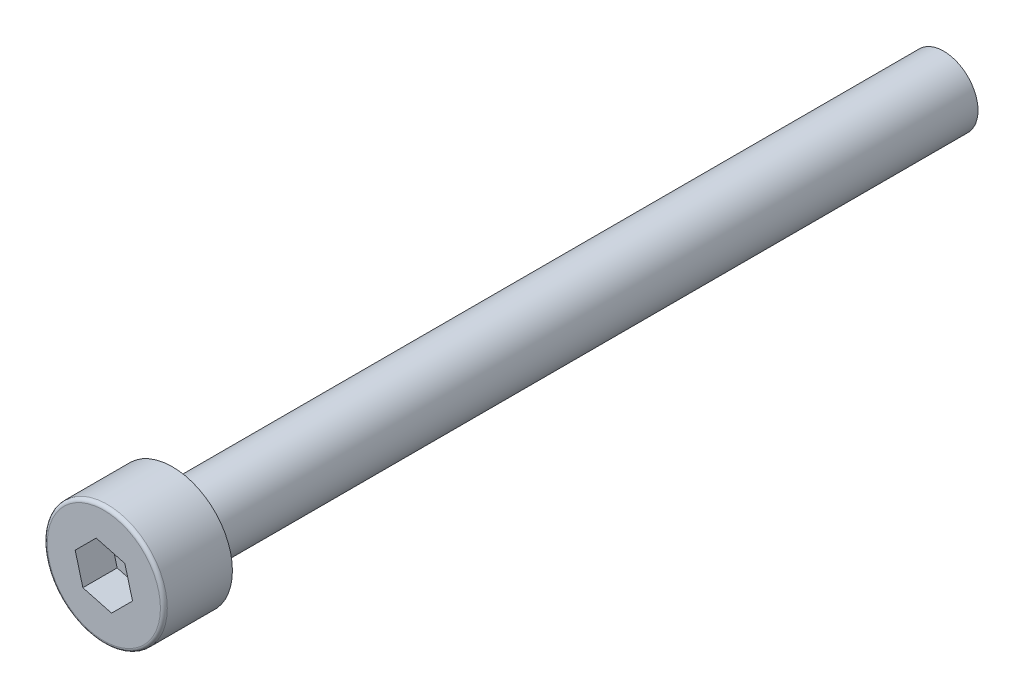
ISO-10303-21;
HEADER;
FILE_DESCRIPTION(('STEP AP214'),'2;1');
FILE_NAME('part.step','',(''),(''),'','','');
FILE_SCHEMA(('AUTOMOTIVE_DESIGN { 1 0 10303 214 1 1 1 1 }'));
ENDSEC;
DATA;
#1=APPLICATION_CONTEXT('core data for automotive mechanical design processes');
#2=APPLICATION_PROTOCOL_DEFINITION('international standard','automotive_design',2000,#1);
#3=PRODUCT_CONTEXT('',#1,'mechanical');
#4=PRODUCT('Part','Part','',(#3));
#5=PRODUCT_RELATED_PRODUCT_CATEGORY('part','',(#4));
#6=PRODUCT_DEFINITION_FORMATION('','',#4);
#7=PRODUCT_DEFINITION_CONTEXT('part definition',#1,'design');
#8=PRODUCT_DEFINITION('design','',#6,#7);
#9=PRODUCT_DEFINITION_SHAPE('','',#8);
#10=(LENGTH_UNIT() NAMED_UNIT(*) SI_UNIT(.MILLI.,.METRE.));
#11=(NAMED_UNIT(*) PLANE_ANGLE_UNIT() SI_UNIT($,.RADIAN.));
#12=(NAMED_UNIT(*) SI_UNIT($,.STERADIAN.) SOLID_ANGLE_UNIT());
#13=UNCERTAINTY_MEASURE_WITH_UNIT(LENGTH_MEASURE(1.E-05),#10,'distance_accuracy_value','');
#14=(GEOMETRIC_REPRESENTATION_CONTEXT(3) GLOBAL_UNCERTAINTY_ASSIGNED_CONTEXT((#13)) GLOBAL_UNIT_ASSIGNED_CONTEXT((#10,
#11,#12)) REPRESENTATION_CONTEXT('',''));
#15=CARTESIAN_POINT('',(0.,0.,0.));
#16=DIRECTION('',(0.,0.,1.));
#17=DIRECTION('',(1.,0.,0.));
#18=AXIS2_PLACEMENT_3D('',#15,#16,#17);
#19=CARTESIAN_POINT('',(0.,0.,0.));
#20=DIRECTION('',(0.,0.,1.));
#21=DIRECTION('',(1.,0.,0.));
#22=AXIS2_PLACEMENT_3D('',#19,#20,#21);
#23=PLANE('',#22);
#24=CARTESIAN_POINT('',(0.,0.,0.));
#25=DIRECTION('',(0.,0.,1.));
#26=DIRECTION('',(1.,0.,0.));
#27=AXIS2_PLACEMENT_3D('',#24,#25,#26);
#28=CIRCLE('',#27,3.5);
#29=CARTESIAN_POINT('',(3.5,0.,0.));
#30=VERTEX_POINT('',#29);
#31=EDGE_CURVE('E137',#30,#30,#28,.T.);
#32=ORIENTED_EDGE('',*,*,#31,.F.);
#33=EDGE_LOOP('',(#32));
#34=FACE_BOUND('',#33,.T.);
#35=CARTESIAN_POINT('',(0.,0.,0.));
#36=DIRECTION('',(0.,0.,1.));
#37=DIRECTION('',(1.,0.,0.));
#38=AXIS2_PLACEMENT_3D('',#35,#36,#37);
#39=CIRCLE('',#38,2.);
#40=CARTESIAN_POINT('',(2.,0.,0.));
#41=VERTEX_POINT('',#40);
#42=EDGE_CURVE('E145',#41,#41,#39,.F.);
#43=ORIENTED_EDGE('',*,*,#42,.F.);
#44=EDGE_LOOP('',(#43));
#45=FACE_BOUND('',#44,.T.);
#46=ADVANCED_FACE('F34',(#34,#45),#23,.F.);
#47=CARTESIAN_POINT('',(0.,0.,4.));
#48=DIRECTION('',(0.,0.,-1.));
#49=DIRECTION('',(-1.,0.,0.));
#50=AXIS2_PLACEMENT_3D('',#47,#48,#49);
#51=CYLINDRICAL_SURFACE('',#50,3.5);
#52=CARTESIAN_POINT('',(0.,0.,3.8));
#53=DIRECTION('',(0.,0.,1.));
#54=DIRECTION('',(1.,0.,0.));
#55=AXIS2_PLACEMENT_3D('',#52,#53,#54);
#56=CIRCLE('',#55,3.5);
#57=CARTESIAN_POINT('',(3.5,0.,3.8));
#58=VERTEX_POINT('',#57);
#59=EDGE_CURVE('E11',#58,#58,#56,.F.);
#60=ORIENTED_EDGE('',*,*,#59,.T.);
#61=EDGE_LOOP('',(#60));
#62=FACE_BOUND('',#61,.T.);
#63=ORIENTED_EDGE('',*,*,#31,.T.);
#64=EDGE_LOOP('',(#63));
#65=FACE_BOUND('',#64,.T.);
#66=ADVANCED_FACE('F164',(#62,#65),#51,.T.);
#67=CARTESIAN_POINT('',(0.,0.,4.));
#68=DIRECTION('',(0.,0.,1.));
#69=DIRECTION('',(1.,0.,0.));
#70=AXIS2_PLACEMENT_3D('',#67,#68,#69);
#71=PLANE('',#70);
#72=CARTESIAN_POINT('',(0.,0.,4.));
#73=DIRECTION('',(0.,0.,1.));
#74=DIRECTION('',(1.,0.,0.));
#75=AXIS2_PLACEMENT_3D('',#72,#73,#74);
#76=CIRCLE('',#75,3.3);
#77=CARTESIAN_POINT('',(3.3,0.,4.));
#78=VERTEX_POINT('',#77);
#79=EDGE_CURVE('E42',#78,#78,#76,.T.);
#80=ORIENTED_EDGE('',*,*,#79,.T.);
#81=EDGE_LOOP('',(#80));
#82=FACE_BOUND('',#81,.T.);
#83=DIRECTION('',(0.258819045102521,-0.965925826289068,0.));
#84=VECTOR('',#83,1.);
#85=CARTESIAN_POINT('',(-1.67303260747562,0.448287736084027,4.));
#86=LINE('',#85,#84);
#87=CARTESIAN_POINT('',(-1.67303260747562,0.448287736084027,4.));
#88=VERTEX_POINT('',#87);
#89=CARTESIAN_POINT('',(-1.22474487139159,-1.22474487139159,4.));
#90=VERTEX_POINT('',#89);
#91=EDGE_CURVE('E49',#88,#90,#86,.T.);
#92=ORIENTED_EDGE('',*,*,#91,.F.);
#93=DIRECTION('',(-0.707106781186547,-0.707106781186548,0.));
#94=VECTOR('',#93,1.);
#95=CARTESIAN_POINT('',(-0.448287736084027,1.67303260747562,4.));
#96=LINE('',#95,#94);
#97=CARTESIAN_POINT('',(-0.448287736084027,1.67303260747562,4.));
#98=VERTEX_POINT('',#97);
#99=EDGE_CURVE('E133',#98,#88,#96,.T.);
#100=ORIENTED_EDGE('',*,*,#99,.F.);
#101=DIRECTION('',(-0.965925826289068,0.258819045102521,0.));
#102=VECTOR('',#101,1.);
#103=CARTESIAN_POINT('',(1.22474487139159,1.22474487139159,4.));
#104=LINE('',#103,#102);
#105=CARTESIAN_POINT('',(1.22474487139159,1.22474487139159,4.));
#106=VERTEX_POINT('',#105);
#107=EDGE_CURVE('E131',#106,#98,#104,.T.);
#108=ORIENTED_EDGE('',*,*,#107,.F.);
#109=DIRECTION('',(-0.258819045102521,0.965925826289068,0.));
#110=VECTOR('',#109,1.);
#111=CARTESIAN_POINT('',(1.67303260747562,-0.448287736084027,4.));
#112=LINE('',#111,#110);
#113=CARTESIAN_POINT('',(1.67303260747562,-0.448287736084027,4.));
#114=VERTEX_POINT('',#113);
#115=EDGE_CURVE('E97',#114,#106,#112,.T.);
#116=ORIENTED_EDGE('',*,*,#115,.F.);
#117=DIRECTION('',(0.707106781186547,0.707106781186548,0.));
#118=VECTOR('',#117,1.);
#119=CARTESIAN_POINT('',(0.448287736084026,-1.67303260747562,4.));
#120=LINE('',#119,#118);
#121=CARTESIAN_POINT('',(0.448287736084026,-1.67303260747562,4.));
#122=VERTEX_POINT('',#121);
#123=EDGE_CURVE('E127',#122,#114,#120,.T.);
#124=ORIENTED_EDGE('',*,*,#123,.F.);
#125=DIRECTION('',(0.965925826289068,-0.258819045102521,0.));
#126=VECTOR('',#125,1.);
#127=CARTESIAN_POINT('',(-1.22474487139159,-1.22474487139159,4.));
#128=LINE('',#127,#126);
#129=EDGE_CURVE('E123',#90,#122,#128,.T.);
#130=ORIENTED_EDGE('',*,*,#129,.F.);
#131=EDGE_LOOP('',(#92,#100,#108,#116,#124,#130));
#132=FACE_BOUND('',#131,.T.);
#133=ADVANCED_FACE('F150',(#82,#132),#71,.T.);
#134=CARTESIAN_POINT('',(-1.67303260747562,0.448287736084027,2.));
#135=DIRECTION('',(-0.965925826289068,-0.258819045102521,0.));
#136=DIRECTION('',(0.258819045102521,-0.965925826289068,0.));
#137=AXIS2_PLACEMENT_3D('',#134,#135,#136);
#138=PLANE('',#137);
#139=ORIENTED_EDGE('',*,*,#91,.T.);
#140=DIRECTION('',(0.,0.,1.));
#141=VECTOR('',#140,1.);
#142=CARTESIAN_POINT('',(-1.22474487139159,-1.22474487139159,2.));
#143=LINE('',#142,#141);
#144=CARTESIAN_POINT('',(-1.22474487139159,-1.22474487139159,2.));
#145=VERTEX_POINT('',#144);
#146=EDGE_CURVE('E79',#145,#90,#143,.T.);
#147=ORIENTED_EDGE('',*,*,#146,.F.);
#148=DIRECTION('',(0.258819045102521,-0.965925826289068,0.));
#149=VECTOR('',#148,1.);
#150=CARTESIAN_POINT('',(-1.67303260747562,0.448287736084027,2.));
#151=LINE('',#150,#149);
#152=CARTESIAN_POINT('',(-1.67303260747562,0.448287736084027,2.));
#153=VERTEX_POINT('',#152);
#154=EDGE_CURVE('E135',#153,#145,#151,.T.);
#155=ORIENTED_EDGE('',*,*,#154,.F.);
#156=DIRECTION('',(0.,0.,1.));
#157=VECTOR('',#156,1.);
#158=CARTESIAN_POINT('',(-1.67303260747562,0.448287736084027,2.));
#159=LINE('',#158,#157);
#160=EDGE_CURVE('E57',#153,#88,#159,.T.);
#161=ORIENTED_EDGE('',*,*,#160,.T.);
#162=EDGE_LOOP('',(#139,#147,#155,#161));
#163=FACE_BOUND('',#162,.T.);
#164=ADVANCED_FACE('F176',(#163),#138,.F.);
#165=CARTESIAN_POINT('',(-0.448287736084027,1.67303260747562,2.));
#166=DIRECTION('',(-0.707106781186548,0.707106781186547,0.));
#167=DIRECTION('',(-0.707106781186547,-0.707106781186548,0.));
#168=AXIS2_PLACEMENT_3D('',#165,#166,#167);
#169=PLANE('',#168);
#170=ORIENTED_EDGE('',*,*,#99,.T.);
#171=ORIENTED_EDGE('',*,*,#160,.F.);
#172=DIRECTION('',(-0.707106781186547,-0.707106781186548,0.));
#173=VECTOR('',#172,1.);
#174=CARTESIAN_POINT('',(-0.448287736084027,1.67303260747562,2.));
#175=LINE('',#174,#173);
#176=CARTESIAN_POINT('',(-0.448287736084027,1.67303260747562,2.));
#177=VERTEX_POINT('',#176);
#178=EDGE_CURVE('E109',#177,#153,#175,.T.);
#179=ORIENTED_EDGE('',*,*,#178,.F.);
#180=DIRECTION('',(0.,0.,1.));
#181=VECTOR('',#180,1.);
#182=CARTESIAN_POINT('',(-0.448287736084027,1.67303260747562,2.));
#183=LINE('',#182,#181);
#184=EDGE_CURVE('E101',#177,#98,#183,.T.);
#185=ORIENTED_EDGE('',*,*,#184,.T.);
#186=EDGE_LOOP('',(#170,#171,#179,#185));
#187=FACE_BOUND('',#186,.T.);
#188=ADVANCED_FACE('F179',(#187),#169,.F.);
#189=CARTESIAN_POINT('',(1.22474487139159,1.22474487139159,2.));
#190=DIRECTION('',(0.258819045102521,0.965925826289068,0.));
#191=DIRECTION('',(-0.965925826289068,0.258819045102521,0.));
#192=AXIS2_PLACEMENT_3D('',#189,#190,#191);
#193=PLANE('',#192);
#194=ORIENTED_EDGE('',*,*,#107,.T.);
#195=ORIENTED_EDGE('',*,*,#184,.F.);
#196=DIRECTION('',(-0.965925826289068,0.258819045102521,0.));
#197=VECTOR('',#196,1.);
#198=CARTESIAN_POINT('',(1.22474487139159,1.22474487139159,2.));
#199=LINE('',#198,#197);
#200=CARTESIAN_POINT('',(1.22474487139159,1.22474487139159,2.));
#201=VERTEX_POINT('',#200);
#202=EDGE_CURVE('E105',#201,#177,#199,.T.);
#203=ORIENTED_EDGE('',*,*,#202,.F.);
#204=DIRECTION('',(0.,0.,1.));
#205=VECTOR('',#204,1.);
#206=CARTESIAN_POINT('',(1.22474487139159,1.22474487139159,2.));
#207=LINE('',#206,#205);
#208=EDGE_CURVE('E90',#201,#106,#207,.T.);
#209=ORIENTED_EDGE('',*,*,#208,.T.);
#210=EDGE_LOOP('',(#194,#195,#203,#209));
#211=FACE_BOUND('',#210,.T.);
#212=ADVANCED_FACE('F106',(#211),#193,.F.);
#213=CARTESIAN_POINT('',(1.67303260747562,-0.448287736084027,2.));
#214=DIRECTION('',(0.965925826289068,0.258819045102521,0.));
#215=DIRECTION('',(-0.258819045102521,0.965925826289068,0.));
#216=AXIS2_PLACEMENT_3D('',#213,#214,#215);
#217=PLANE('',#216);
#218=ORIENTED_EDGE('',*,*,#115,.T.);
#219=ORIENTED_EDGE('',*,*,#208,.F.);
#220=DIRECTION('',(-0.258819045102521,0.965925826289068,0.));
#221=VECTOR('',#220,1.);
#222=CARTESIAN_POINT('',(1.67303260747562,-0.448287736084027,2.));
#223=LINE('',#222,#221);
#224=CARTESIAN_POINT('',(1.67303260747562,-0.448287736084027,2.));
#225=VERTEX_POINT('',#224);
#226=EDGE_CURVE('E94',#225,#201,#223,.T.);
#227=ORIENTED_EDGE('',*,*,#226,.F.);
#228=DIRECTION('',(0.,0.,1.));
#229=VECTOR('',#228,1.);
#230=CARTESIAN_POINT('',(1.67303260747562,-0.448287736084027,2.));
#231=LINE('',#230,#229);
#232=EDGE_CURVE('E102',#225,#114,#231,.T.);
#233=ORIENTED_EDGE('',*,*,#232,.T.);
#234=EDGE_LOOP('',(#218,#219,#227,#233));
#235=FACE_BOUND('',#234,.T.);
#236=ADVANCED_FACE('F92',(#235),#217,.F.);
#237=CARTESIAN_POINT('',(0.448287736084026,-1.67303260747562,2.));
#238=DIRECTION('',(0.707106781186548,-0.707106781186547,0.));
#239=DIRECTION('',(0.707106781186547,0.707106781186548,0.));
#240=AXIS2_PLACEMENT_3D('',#237,#238,#239);
#241=PLANE('',#240);
#242=ORIENTED_EDGE('',*,*,#123,.T.);
#243=ORIENTED_EDGE('',*,*,#232,.F.);
#244=DIRECTION('',(0.707106781186547,0.707106781186548,0.));
#245=VECTOR('',#244,1.);
#246=CARTESIAN_POINT('',(0.448287736084026,-1.67303260747562,2.));
#247=LINE('',#246,#245);
#248=CARTESIAN_POINT('',(0.448287736084026,-1.67303260747562,2.));
#249=VERTEX_POINT('',#248);
#250=EDGE_CURVE('E115',#249,#225,#247,.T.);
#251=ORIENTED_EDGE('',*,*,#250,.F.);
#252=DIRECTION('',(0.,0.,1.));
#253=VECTOR('',#252,1.);
#254=CARTESIAN_POINT('',(0.448287736084026,-1.67303260747562,2.));
#255=LINE('',#254,#253);
#256=EDGE_CURVE('E140',#249,#122,#255,.T.);
#257=ORIENTED_EDGE('',*,*,#256,.T.);
#258=EDGE_LOOP('',(#242,#243,#251,#257));
#259=FACE_BOUND('',#258,.T.);
#260=ADVANCED_FACE('F183',(#259),#241,.F.);
#261=CARTESIAN_POINT('',(-1.22474487139159,-1.22474487139159,2.));
#262=DIRECTION('',(-0.258819045102521,-0.965925826289068,0.));
#263=DIRECTION('',(0.965925826289068,-0.258819045102521,0.));
#264=AXIS2_PLACEMENT_3D('',#261,#262,#263);
#265=PLANE('',#264);
#266=ORIENTED_EDGE('',*,*,#129,.T.);
#267=ORIENTED_EDGE('',*,*,#256,.F.);
#268=DIRECTION('',(0.965925826289068,-0.258819045102521,0.));
#269=VECTOR('',#268,1.);
#270=CARTESIAN_POINT('',(-1.22474487139159,-1.22474487139159,2.));
#271=LINE('',#270,#269);
#272=EDGE_CURVE('E117',#145,#249,#271,.T.);
#273=ORIENTED_EDGE('',*,*,#272,.F.);
#274=ORIENTED_EDGE('',*,*,#146,.T.);
#275=EDGE_LOOP('',(#266,#267,#273,#274));
#276=FACE_BOUND('',#275,.T.);
#277=ADVANCED_FACE('F180',(#276),#265,.F.);
#278=CARTESIAN_POINT('',(0.,0.,2.));
#279=DIRECTION('',(0.,0.,1.));
#280=DIRECTION('',(1.,0.,0.));
#281=AXIS2_PLACEMENT_3D('',#278,#279,#280);
#282=PLANE('',#281);
#283=ORIENTED_EDGE('',*,*,#154,.T.);
#284=ORIENTED_EDGE('',*,*,#272,.T.);
#285=ORIENTED_EDGE('',*,*,#250,.T.);
#286=ORIENTED_EDGE('',*,*,#226,.T.);
#287=ORIENTED_EDGE('',*,*,#202,.T.);
#288=ORIENTED_EDGE('',*,*,#178,.T.);
#289=EDGE_LOOP('',(#283,#284,#285,#286,#287,#288));
#290=FACE_BOUND('',#289,.T.);
#291=ADVANCED_FACE('F112',(#290),#282,.T.);
#292=CARTESIAN_POINT('',(0.,0.,-45.));
#293=DIRECTION('',(0.,0.,1.));
#294=DIRECTION('',(1.,0.,0.));
#295=AXIS2_PLACEMENT_3D('',#292,#293,#294);
#296=CYLINDRICAL_SURFACE('',#295,2.);
#297=CARTESIAN_POINT('',(0.,0.,-45.));
#298=DIRECTION('',(0.,0.,-1.));
#299=DIRECTION('',(-1.,0.,0.));
#300=AXIS2_PLACEMENT_3D('',#297,#298,#299);
#301=CIRCLE('',#300,2.);
#302=CARTESIAN_POINT('',(2.,0.,-45.));
#303=VERTEX_POINT('',#302);
#304=EDGE_CURVE('E124',#303,#303,#301,.T.);
#305=CARTESIAN_POINT('',(2.,0.,-45.));
#306=CARTESIAN_POINT('',(2.,0.,-44.53125));
#307=CARTESIAN_POINT('',(2.,0.,-44.0625));
#308=CARTESIAN_POINT('',(2.,0.,-43.125));
#309=CARTESIAN_POINT('',(2.,0.,-42.65625));
#310=CARTESIAN_POINT('',(2.,0.,-41.71875));
#311=CARTESIAN_POINT('',(2.,0.,-41.25));
#312=CARTESIAN_POINT('',(2.,0.,-40.3125));
#313=CARTESIAN_POINT('',(2.,0.,-39.84375));
#314=CARTESIAN_POINT('',(2.,0.,-38.90625));
#315=CARTESIAN_POINT('',(2.,0.,-38.4375));
#316=CARTESIAN_POINT('',(2.,0.,-37.5));
#317=CARTESIAN_POINT('',(2.,0.,-37.03125));
#318=CARTESIAN_POINT('',(2.,0.,-36.09375));
#319=CARTESIAN_POINT('',(2.,0.,-35.625));
#320=CARTESIAN_POINT('',(2.,0.,-34.6875));
#321=CARTESIAN_POINT('',(2.,0.,-34.21875));
#322=CARTESIAN_POINT('',(2.,0.,-33.28125));
#323=CARTESIAN_POINT('',(2.,0.,-32.8125));
#324=CARTESIAN_POINT('',(2.,0.,-31.875));
#325=CARTESIAN_POINT('',(2.,0.,-31.40625));
#326=CARTESIAN_POINT('',(2.,0.,-30.46875));
#327=CARTESIAN_POINT('',(2.,0.,-30.));
#328=CARTESIAN_POINT('',(2.,0.,-29.0625));
#329=CARTESIAN_POINT('',(2.,0.,-28.59375));
#330=CARTESIAN_POINT('',(2.,0.,-27.65625));
#331=CARTESIAN_POINT('',(2.,0.,-27.1875));
#332=CARTESIAN_POINT('',(2.,0.,-26.25));
#333=CARTESIAN_POINT('',(2.,0.,-25.78125));
#334=CARTESIAN_POINT('',(2.,0.,-24.84375));
#335=CARTESIAN_POINT('',(2.,0.,-24.375));
#336=CARTESIAN_POINT('',(2.,0.,-23.4375));
#337=CARTESIAN_POINT('',(2.,0.,-22.96875));
#338=CARTESIAN_POINT('',(2.,0.,-22.03125));
#339=CARTESIAN_POINT('',(2.,0.,-21.5625));
#340=CARTESIAN_POINT('',(2.,0.,-20.625));
#341=CARTESIAN_POINT('',(2.,0.,-20.15625));
#342=CARTESIAN_POINT('',(2.,0.,-19.21875));
#343=CARTESIAN_POINT('',(2.,0.,-18.75));
#344=CARTESIAN_POINT('',(2.,0.,-17.8125));
#345=CARTESIAN_POINT('',(2.,0.,-17.34375));
#346=CARTESIAN_POINT('',(2.,0.,-16.40625));
#347=CARTESIAN_POINT('',(2.,0.,-15.9375));
#348=CARTESIAN_POINT('',(2.,0.,-15.));
#349=CARTESIAN_POINT('',(2.,0.,-14.53125));
#350=CARTESIAN_POINT('',(2.,0.,-13.59375));
#351=CARTESIAN_POINT('',(2.,0.,-13.125));
#352=CARTESIAN_POINT('',(2.,0.,-12.1875));
#353=CARTESIAN_POINT('',(2.,0.,-11.71875));
#354=CARTESIAN_POINT('',(2.,0.,-10.78125));
#355=CARTESIAN_POINT('',(2.,0.,-10.3125));
#356=CARTESIAN_POINT('',(2.,0.,-9.37500000000001));
#357=CARTESIAN_POINT('',(2.,0.,-8.90625000000001));
#358=CARTESIAN_POINT('',(2.,0.,-7.96875000000001));
#359=CARTESIAN_POINT('',(2.,0.,-7.5));
#360=CARTESIAN_POINT('',(2.,0.,-6.5625));
#361=CARTESIAN_POINT('',(2.,0.,-6.09375));
#362=CARTESIAN_POINT('',(2.,0.,-5.15625000000001));
#363=CARTESIAN_POINT('',(2.,0.,-4.68750000000001));
#364=CARTESIAN_POINT('',(2.,0.,-3.75000000000001));
#365=CARTESIAN_POINT('',(2.,0.,-3.28125000000001));
#366=CARTESIAN_POINT('',(2.,0.,-2.34375000000001));
#367=CARTESIAN_POINT('',(2.,0.,-1.87500000000001));
#368=CARTESIAN_POINT('',(2.,0.,-0.937500000000006));
#369=CARTESIAN_POINT('',(2.,0.,-0.468750000000007));
#370=CARTESIAN_POINT('',(2.,0.,0.));
#371=B_SPLINE_CURVE_WITH_KNOTS('',3,(#305,#306,#307,#308,#309,#310,#311,#312,#313,#314,#315,
#316,#317,#318,#319,#320,#321,#322,#323,#324,#325,#326,#327,#328,#329,#330,#331,#332,#333,#334,
#335,#336,#337,#338,#339,#340,#341,#342,#343,#344,#345,#346,#347,#348,#349,#350,#351,#352,#353,
#354,#355,#356,#357,#358,#359,#360,#361,#362,#363,#364,#365,#366,#367,#368,#369,#370),
.UNSPECIFIED.,.F.,.F.,(4,2,2,2,2,2,2,2,2,2,2,2,2,2,2,2,2,2,2,2,2,2,2,2,2,2,2,2,2,2,2,2,4),(0.,
1.40625,2.8125,4.21874999999999,5.625,7.03125,8.43749999999999,9.84374999999999,11.25,12.65625,
14.0625,15.46875,16.875,18.28125,19.6875,21.09375,22.5,23.90625,25.3125,26.71875,28.125,
29.53125,30.9375,32.34375,33.75,35.15625,36.5625,37.96875,39.375,40.78125,42.1875,43.59375,45.),.UNSPECIFIED.);
#372=EDGE_CURVE('BSEAM159',#303,#41,#371,.T.);
#373=ORIENTED_EDGE('',*,*,#304,.F.);
#374=ORIENTED_EDGE('',*,*,#42,.T.);
#375=ORIENTED_EDGE('',*,*,#372,.T.);
#376=ORIENTED_EDGE('',*,*,#372,.F.);
#377=EDGE_LOOP('',(#373,#375,#374,#376));
#378=FACE_BOUND('',#377,.T.);
#379=ADVANCED_FACE('F159',(#378),#296,.T.);
#380=CARTESIAN_POINT('',(0.,0.,-45.));
#381=DIRECTION('',(0.,0.,-1.));
#382=DIRECTION('',(-1.,0.,0.));
#383=AXIS2_PLACEMENT_3D('',#380,#381,#382);
#384=PLANE('',#383);
#385=ORIENTED_EDGE('',*,*,#304,.T.);
#386=EDGE_LOOP('',(#385));
#387=FACE_BOUND('',#386,.T.);
#388=ADVANCED_FACE('F154',(#387),#384,.T.);
#389=CARTESIAN_POINT('',(0.,0.,3.8));
#390=DIRECTION('',(0.,0.,1.));
#391=DIRECTION('',(1.,0.,0.));
#392=AXIS2_PLACEMENT_3D('',#389,#390,#391);
#393=TOROIDAL_SURFACE('',#392,3.3,0.2);
#394=ORIENTED_EDGE('',*,*,#59,.F.);
#395=EDGE_LOOP('',(#394));
#396=FACE_BOUND('',#395,.T.);
#397=ORIENTED_EDGE('',*,*,#79,.F.);
#398=EDGE_LOOP('',(#397));
#399=FACE_BOUND('',#398,.T.);
#400=ADVANCED_FACE('F36',(#396,#399),#393,.T.);
#401=CLOSED_SHELL('',(#46,#66,#133,#164,#188,#212,#236,#260,#277,#291,#379,#388,#400));
#402=MANIFOLD_SOLID_BREP('B2',#401);
#403=ADVANCED_BREP_SHAPE_REPRESENTATION('',(#18,#402),#14);
#404=SHAPE_DEFINITION_REPRESENTATION(#9,#403);
ENDSEC;
END-ISO-10303-21;
